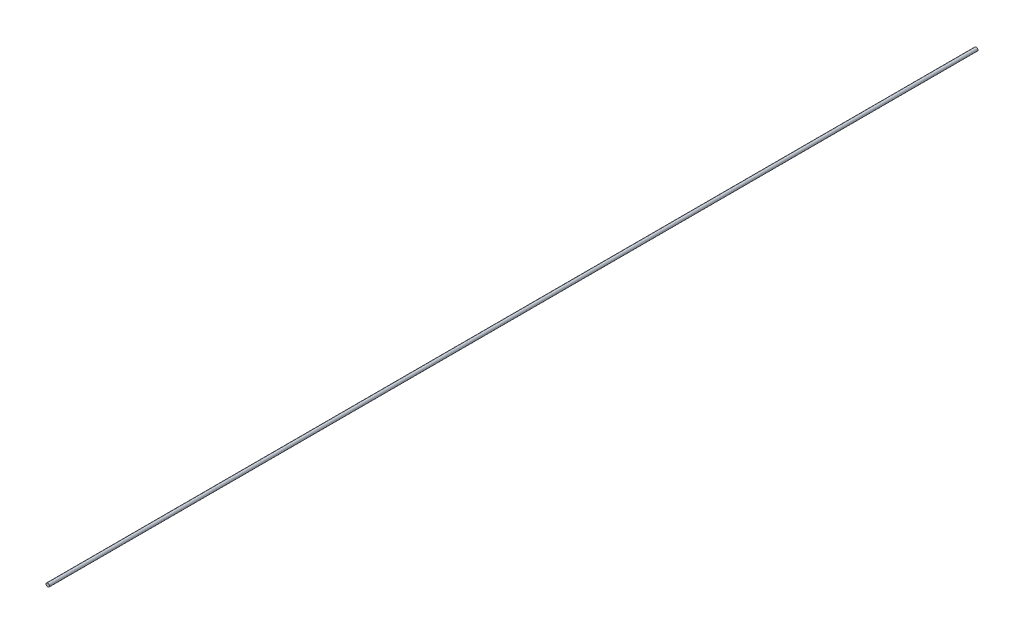
ISO-10303-21;
HEADER;
FILE_DESCRIPTION(('STEP AP214'),'2;1');
FILE_NAME('part.step','',(''),(''),'','','');
FILE_SCHEMA(('AUTOMOTIVE_DESIGN { 1 0 10303 214 1 1 1 1 }'));
ENDSEC;
DATA;
#1=APPLICATION_CONTEXT('core data for automotive mechanical design processes');
#2=APPLICATION_PROTOCOL_DEFINITION('international standard','automotive_design',2000,#1);
#3=PRODUCT_CONTEXT('',#1,'mechanical');
#4=PRODUCT('Part','Part','',(#3));
#5=PRODUCT_RELATED_PRODUCT_CATEGORY('part','',(#4));
#6=PRODUCT_DEFINITION_FORMATION('','',#4);
#7=PRODUCT_DEFINITION_CONTEXT('part definition',#1,'design');
#8=PRODUCT_DEFINITION('design','',#6,#7);
#9=PRODUCT_DEFINITION_SHAPE('','',#8);
#10=(LENGTH_UNIT() NAMED_UNIT(*) SI_UNIT(.MILLI.,.METRE.));
#11=(NAMED_UNIT(*) PLANE_ANGLE_UNIT() SI_UNIT($,.RADIAN.));
#12=(NAMED_UNIT(*) SI_UNIT($,.STERADIAN.) SOLID_ANGLE_UNIT());
#13=UNCERTAINTY_MEASURE_WITH_UNIT(LENGTH_MEASURE(1.E-05),#10,'distance_accuracy_value','');
#14=(GEOMETRIC_REPRESENTATION_CONTEXT(3) GLOBAL_UNCERTAINTY_ASSIGNED_CONTEXT((#13)) GLOBAL_UNIT_ASSIGNED_CONTEXT((#10,
#11,#12)) REPRESENTATION_CONTEXT('',''));
#15=CARTESIAN_POINT('',(0.,0.,0.));
#16=DIRECTION('',(0.,0.,1.));
#17=DIRECTION('',(1.,0.,0.));
#18=AXIS2_PLACEMENT_3D('',#15,#16,#17);
#19=CARTESIAN_POINT('',(0.,0.,108.));
#20=DIRECTION('',(0.,0.,-1.));
#21=DIRECTION('',(-1.,0.,0.));
#22=AXIS2_PLACEMENT_3D('',#19,#20,#21);
#23=CYLINDRICAL_SURFACE('',#22,0.2);
#24=CARTESIAN_POINT('',(0.,0.,108.));
#25=DIRECTION('',(0.,0.,1.));
#26=DIRECTION('',(1.,0.,0.));
#27=AXIS2_PLACEMENT_3D('',#24,#25,#26);
#28=CIRCLE('',#27,0.2);
#29=CARTESIAN_POINT('',(0.2,0.,108.));
#30=VERTEX_POINT('',#29);
#31=EDGE_CURVE('E10',#30,#30,#28,.T.);
#32=ORIENTED_EDGE('',*,*,#31,.F.);
#33=EDGE_LOOP('',(#32));
#34=FACE_BOUND('',#33,.T.);
#35=CARTESIAN_POINT('',(0.,0.,0.));
#36=DIRECTION('',(0.,0.,1.));
#37=DIRECTION('',(1.,0.,0.));
#38=AXIS2_PLACEMENT_3D('',#35,#36,#37);
#39=CIRCLE('',#38,0.2);
#40=CARTESIAN_POINT('',(0.2,0.,0.));
#41=VERTEX_POINT('',#40);
#42=EDGE_CURVE('E36',#41,#41,#39,.T.);
#43=ORIENTED_EDGE('',*,*,#42,.T.);
#44=EDGE_LOOP('',(#43));
#45=FACE_BOUND('',#44,.T.);
#46=ADVANCED_FACE('F33',(#34,#45),#23,.T.);
#47=CARTESIAN_POINT('',(0.,0.,108.));
#48=DIRECTION('',(0.,0.,1.));
#49=DIRECTION('',(1.,0.,0.));
#50=AXIS2_PLACEMENT_3D('',#47,#48,#49);
#51=PLANE('',#50);
#52=ORIENTED_EDGE('',*,*,#31,.T.);
#53=EDGE_LOOP('',(#52));
#54=FACE_BOUND('',#53,.T.);
#55=ADVANCED_FACE('F48',(#54),#51,.T.);
#56=CARTESIAN_POINT('',(0.,0.,0.));
#57=DIRECTION('',(0.,0.,1.));
#58=DIRECTION('',(1.,0.,0.));
#59=AXIS2_PLACEMENT_3D('',#56,#57,#58);
#60=PLANE('',#59);
#61=ORIENTED_EDGE('',*,*,#42,.F.);
#62=EDGE_LOOP('',(#61));
#63=FACE_BOUND('',#62,.T.);
#64=ADVANCED_FACE('F46',(#63),#60,.F.);
#65=CLOSED_SHELL('',(#46,#55,#64));
#66=MANIFOLD_SOLID_BREP('B2',#65);
#67=ADVANCED_BREP_SHAPE_REPRESENTATION('',(#18,#66),#14);
#68=SHAPE_DEFINITION_REPRESENTATION(#9,#67);
ENDSEC;
END-ISO-10303-21;
